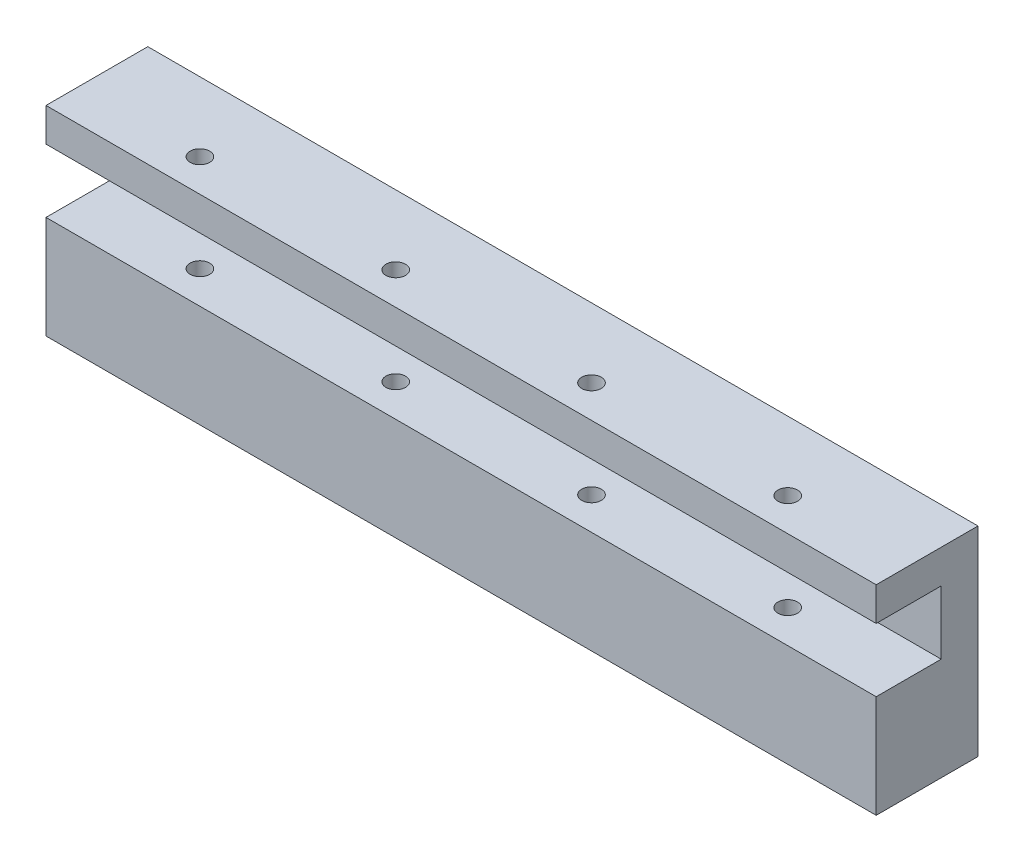
ISO-10303-21;
HEADER;
FILE_DESCRIPTION(('STEP AP214'),'2;1');
FILE_NAME('part.step','',(''),(''),'','','');
FILE_SCHEMA(('AUTOMOTIVE_DESIGN { 1 0 10303 214 1 1 1 1 }'));
ENDSEC;
DATA;
#1=APPLICATION_CONTEXT('core data for automotive mechanical design processes');
#2=APPLICATION_PROTOCOL_DEFINITION('international standard','automotive_design',2000,#1);
#3=PRODUCT_CONTEXT('',#1,'mechanical');
#4=PRODUCT('Part','Part','',(#3));
#5=PRODUCT_RELATED_PRODUCT_CATEGORY('part','',(#4));
#6=PRODUCT_DEFINITION_FORMATION('','',#4);
#7=PRODUCT_DEFINITION_CONTEXT('part definition',#1,'design');
#8=PRODUCT_DEFINITION('design','',#6,#7);
#9=PRODUCT_DEFINITION_SHAPE('','',#8);
#10=(LENGTH_UNIT() NAMED_UNIT(*) SI_UNIT(.MILLI.,.METRE.));
#11=(NAMED_UNIT(*) PLANE_ANGLE_UNIT() SI_UNIT($,.RADIAN.));
#12=(NAMED_UNIT(*) SI_UNIT($,.STERADIAN.) SOLID_ANGLE_UNIT());
#13=UNCERTAINTY_MEASURE_WITH_UNIT(LENGTH_MEASURE(1.E-05),#10,'distance_accuracy_value','');
#14=(GEOMETRIC_REPRESENTATION_CONTEXT(3) GLOBAL_UNCERTAINTY_ASSIGNED_CONTEXT((#13)) GLOBAL_UNIT_ASSIGNED_CONTEXT((#10,
#11,#12)) REPRESENTATION_CONTEXT('',''));
#15=CARTESIAN_POINT('',(0.,0.,0.));
#16=DIRECTION('',(0.,0.,1.));
#17=DIRECTION('',(1.,0.,0.));
#18=AXIS2_PLACEMENT_3D('',#15,#16,#17);
#19=CARTESIAN_POINT('',(-89.8910476017454,-16.65,-13.));
#20=DIRECTION('',(-1.,0.,0.));
#21=DIRECTION('',(0.,0.,1.));
#22=AXIS2_PLACEMENT_3D('',#19,#20,#21);
#23=PLANE('',#22);
#24=DIRECTION('',(0.,-1.,0.));
#25=VECTOR('',#24,1.);
#26=CARTESIAN_POINT('',(-89.8910476017454,-16.65,0.));
#27=LINE('',#26,#25);
#28=CARTESIAN_POINT('',(-89.8910476017454,-29.03,0.));
#29=VERTEX_POINT('',#28);
#30=CARTESIAN_POINT('',(-89.8910476017454,-42.15,0.));
#31=VERTEX_POINT('',#30);
#32=EDGE_CURVE('E131',#29,#31,#27,.T.);
#33=ORIENTED_EDGE('',*,*,#32,.F.);
#34=DIRECTION('',(0.,0.,-1.));
#35=VECTOR('',#34,1.);
#36=CARTESIAN_POINT('',(-89.8910476017454,-29.03,1.2E-05));
#37=LINE('',#36,#35);
#38=CARTESIAN_POINT('',(-89.8910476017454,-29.03,-8.3));
#39=VERTEX_POINT('',#38);
#40=EDGE_CURVE('E115',#29,#39,#37,.T.);
#41=ORIENTED_EDGE('',*,*,#40,.T.);
#42=DIRECTION('',(0.,-1.,0.));
#43=VECTOR('',#42,1.);
#44=CARTESIAN_POINT('',(-89.8910476017454,-20.93,-8.3));
#45=LINE('',#44,#43);
#46=CARTESIAN_POINT('',(-89.8910476017454,-20.93,-8.3));
#47=VERTEX_POINT('',#46);
#48=EDGE_CURVE('E121',#47,#39,#45,.T.);
#49=ORIENTED_EDGE('',*,*,#48,.F.);
#50=DIRECTION('',(0.,0.,-1.));
#51=VECTOR('',#50,1.);
#52=CARTESIAN_POINT('',(-89.8910476017454,-20.93,1.2E-05));
#53=LINE('',#52,#51);
#54=CARTESIAN_POINT('',(-89.8910476017454,-20.93,0.));
#55=VERTEX_POINT('',#54);
#56=EDGE_CURVE('E208',#55,#47,#53,.T.);
#57=ORIENTED_EDGE('',*,*,#56,.F.);
#58=CARTESIAN_POINT('',(-89.8910476017454,-16.65,0.));
#59=VERTEX_POINT('',#58);
#60=EDGE_CURVE('E133',#59,#55,#27,.T.);
#61=ORIENTED_EDGE('',*,*,#60,.F.);
#62=DIRECTION('',(0.,0.,1.));
#63=VECTOR('',#62,1.);
#64=CARTESIAN_POINT('',(-89.8910476017454,-16.65,-13.));
#65=LINE('',#64,#63);
#66=CARTESIAN_POINT('',(-89.8910476017454,-16.65,-13.));
#67=VERTEX_POINT('',#66);
#68=EDGE_CURVE('E60',#67,#59,#65,.T.);
#69=ORIENTED_EDGE('',*,*,#68,.F.);
#70=DIRECTION('',(0.,-1.,0.));
#71=VECTOR('',#70,1.);
#72=CARTESIAN_POINT('',(-89.8910476017454,-16.65,-13.));
#73=LINE('',#72,#71);
#74=CARTESIAN_POINT('',(-89.8910476017454,-42.15,-13.));
#75=VERTEX_POINT('',#74);
#76=EDGE_CURVE('E138',#67,#75,#73,.T.);
#77=ORIENTED_EDGE('',*,*,#76,.T.);
#78=DIRECTION('',(0.,0.,1.));
#79=VECTOR('',#78,1.);
#80=CARTESIAN_POINT('',(-89.8910476017454,-42.15,-13.));
#81=LINE('',#80,#79);
#82=EDGE_CURVE('E87',#75,#31,#81,.T.);
#83=ORIENTED_EDGE('',*,*,#82,.T.);
#84=EDGE_LOOP('',(#33,#41,#49,#57,#61,#69,#77,#83));
#85=FACE_BOUND('',#84,.T.);
#86=ADVANCED_FACE('F35',(#85),#23,.T.);
#87=CARTESIAN_POINT('',(16.1089523982546,-16.65,-13.));
#88=DIRECTION('',(1.,0.,0.));
#89=DIRECTION('',(0.,0.,-1.));
#90=AXIS2_PLACEMENT_3D('',#87,#88,#89);
#91=PLANE('',#90);
#92=DIRECTION('',(0.,1.,0.));
#93=VECTOR('',#92,1.);
#94=CARTESIAN_POINT('',(16.1089523982546,-20.93,-8.3));
#95=LINE('',#94,#93);
#96=CARTESIAN_POINT('',(16.1089523982546,-29.03,-8.3));
#97=VERTEX_POINT('',#96);
#98=CARTESIAN_POINT('',(16.1089523982546,-20.93,-8.3));
#99=VERTEX_POINT('',#98);
#100=EDGE_CURVE('E120',#97,#99,#95,.T.);
#101=ORIENTED_EDGE('',*,*,#100,.F.);
#102=DIRECTION('',(0.,0.,-1.));
#103=VECTOR('',#102,1.);
#104=CARTESIAN_POINT('',(16.1089523982546,-29.03,1.2E-05));
#105=LINE('',#104,#103);
#106=CARTESIAN_POINT('',(16.1089523982546,-29.03,0.));
#107=VERTEX_POINT('',#106);
#108=EDGE_CURVE('E117',#107,#97,#105,.T.);
#109=ORIENTED_EDGE('',*,*,#108,.F.);
#110=DIRECTION('',(0.,1.,0.));
#111=VECTOR('',#110,1.);
#112=CARTESIAN_POINT('',(16.1089523982546,-16.65,0.));
#113=LINE('',#112,#111);
#114=CARTESIAN_POINT('',(16.1089523982546,-42.15,0.));
#115=VERTEX_POINT('',#114);
#116=EDGE_CURVE('E153',#115,#107,#113,.T.);
#117=ORIENTED_EDGE('',*,*,#116,.F.);
#118=DIRECTION('',(0.,0.,1.));
#119=VECTOR('',#118,1.);
#120=CARTESIAN_POINT('',(16.1089523982546,-42.15,-13.));
#121=LINE('',#120,#119);
#122=CARTESIAN_POINT('',(16.1089523982546,-42.15,-13.));
#123=VERTEX_POINT('',#122);
#124=EDGE_CURVE('E162',#123,#115,#121,.T.);
#125=ORIENTED_EDGE('',*,*,#124,.F.);
#126=DIRECTION('',(0.,1.,0.));
#127=VECTOR('',#126,1.);
#128=CARTESIAN_POINT('',(16.1089523982546,-16.65,-13.));
#129=LINE('',#128,#127);
#130=CARTESIAN_POINT('',(16.1089523982546,-16.65,-13.));
#131=VERTEX_POINT('',#130);
#132=EDGE_CURVE('E143',#123,#131,#129,.T.);
#133=ORIENTED_EDGE('',*,*,#132,.T.);
#134=DIRECTION('',(0.,0.,1.));
#135=VECTOR('',#134,1.);
#136=CARTESIAN_POINT('',(16.1089523982546,-16.65,-13.));
#137=LINE('',#136,#135);
#138=CARTESIAN_POINT('',(16.1089523982546,-16.65,0.));
#139=VERTEX_POINT('',#138);
#140=EDGE_CURVE('E159',#131,#139,#137,.T.);
#141=ORIENTED_EDGE('',*,*,#140,.T.);
#142=CARTESIAN_POINT('',(16.1089523982546,-20.93,0.));
#143=VERTEX_POINT('',#142);
#144=EDGE_CURVE('E152',#143,#139,#113,.T.);
#145=ORIENTED_EDGE('',*,*,#144,.F.);
#146=DIRECTION('',(0.,0.,-1.));
#147=VECTOR('',#146,1.);
#148=CARTESIAN_POINT('',(16.1089523982546,-20.93,1.2E-05));
#149=LINE('',#148,#147);
#150=EDGE_CURVE('E51',#143,#99,#149,.T.);
#151=ORIENTED_EDGE('',*,*,#150,.T.);
#152=EDGE_LOOP('',(#101,#109,#117,#125,#133,#141,#145,#151));
#153=FACE_BOUND('',#152,.T.);
#154=ADVANCED_FACE('F211',(#153),#91,.T.);
#155=CARTESIAN_POINT('',(0.,0.,0.));
#156=DIRECTION('',(0.,0.,1.));
#157=DIRECTION('',(1.,0.,0.));
#158=AXIS2_PLACEMENT_3D('',#155,#156,#157);
#159=PLANE('',#158);
#160=ORIENTED_EDGE('',*,*,#116,.T.);
#161=DIRECTION('',(-1.,0.,0.));
#162=VECTOR('',#161,1.);
#163=CARTESIAN_POINT('',(0.,-29.03,0.));
#164=LINE('',#163,#162);
#165=EDGE_CURVE('E11',#107,#29,#164,.T.);
#166=ORIENTED_EDGE('',*,*,#165,.T.);
#167=ORIENTED_EDGE('',*,*,#32,.T.);
#168=DIRECTION('',(1.,0.,0.));
#169=VECTOR('',#168,1.);
#170=CARTESIAN_POINT('',(-89.8910476017454,-42.15,0.));
#171=LINE('',#170,#169);
#172=EDGE_CURVE('E149',#31,#115,#171,.T.);
#173=ORIENTED_EDGE('',*,*,#172,.T.);
#174=EDGE_LOOP('',(#160,#166,#167,#173));
#175=FACE_BOUND('',#174,.T.);
#176=ADVANCED_FACE('F233',(#175),#159,.T.);
#177=ORIENTED_EDGE('',*,*,#60,.T.);
#178=DIRECTION('',(1.,0.,0.));
#179=VECTOR('',#178,1.);
#180=CARTESIAN_POINT('',(0.,-20.93,0.));
#181=LINE('',#180,#179);
#182=EDGE_CURVE('E43',#55,#143,#181,.T.);
#183=ORIENTED_EDGE('',*,*,#182,.T.);
#184=ORIENTED_EDGE('',*,*,#144,.T.);
#185=DIRECTION('',(-1.,0.,0.));
#186=VECTOR('',#185,1.);
#187=CARTESIAN_POINT('',(-89.8910476017454,-16.65,0.));
#188=LINE('',#187,#186);
#189=EDGE_CURVE('E141',#139,#59,#188,.T.);
#190=ORIENTED_EDGE('',*,*,#189,.T.);
#191=EDGE_LOOP('',(#177,#183,#184,#190));
#192=FACE_BOUND('',#191,.T.);
#193=ADVANCED_FACE('F213',(#192),#159,.T.);
#194=CARTESIAN_POINT('',(-89.8910476017454,-16.65,-13.));
#195=DIRECTION('',(0.,1.,0.));
#196=DIRECTION('',(0.,0.,1.));
#197=AXIS2_PLACEMENT_3D('',#194,#195,#196);
#198=PLANE('',#197);
#199=CARTESIAN_POINT('',(-74.3909856023909,-16.65,-4.15));
#200=DIRECTION('',(0.,1.,0.));
#201=DIRECTION('',(0.,0.,1.));
#202=AXIS2_PLACEMENT_3D('',#199,#200,#201);
#203=CIRCLE('',#202,1.25);
#204=CARTESIAN_POINT('',(-74.3909856023909,-16.65,-2.9));
#205=VERTEX_POINT('',#204);
#206=EDGE_CURVE('E295',#205,#205,#203,.T.);
#207=ORIENTED_EDGE('',*,*,#206,.F.);
#208=EDGE_LOOP('',(#207));
#209=FACE_BOUND('',#208,.T.);
#210=CARTESIAN_POINT('',(-49.3909856023909,-16.65,-4.15));
#211=DIRECTION('',(0.,1.,0.));
#212=DIRECTION('',(0.,0.,1.));
#213=AXIS2_PLACEMENT_3D('',#210,#211,#212);
#214=CIRCLE('',#213,1.24999999999999);
#215=CARTESIAN_POINT('',(-49.3909856023909,-16.65,-2.90000000000001));
#216=VERTEX_POINT('',#215);
#217=EDGE_CURVE('E180',#216,#216,#214,.T.);
#218=ORIENTED_EDGE('',*,*,#217,.F.);
#219=EDGE_LOOP('',(#218));
#220=FACE_BOUND('',#219,.T.);
#221=CARTESIAN_POINT('',(0.608952398254592,-16.65,-4.20567731927423));
#222=DIRECTION('',(0.,1.,0.));
#223=DIRECTION('',(0.,0.,1.));
#224=AXIS2_PLACEMENT_3D('',#221,#222,#223);
#225=CIRCLE('',#224,1.25);
#226=CARTESIAN_POINT('',(0.608952398254592,-16.65,-2.95567731927423));
#227=VERTEX_POINT('',#226);
#228=EDGE_CURVE('E177',#227,#227,#225,.T.);
#229=ORIENTED_EDGE('',*,*,#228,.F.);
#230=EDGE_LOOP('',(#229));
#231=FACE_BOUND('',#230,.T.);
#232=CARTESIAN_POINT('',(-24.3909856023909,-16.65,-4.15));
#233=DIRECTION('',(0.,1.,0.));
#234=DIRECTION('',(0.,0.,1.));
#235=AXIS2_PLACEMENT_3D('',#232,#233,#234);
#236=CIRCLE('',#235,1.25);
#237=CARTESIAN_POINT('',(-24.3909856023909,-16.65,-2.9));
#238=VERTEX_POINT('',#237);
#239=EDGE_CURVE('E195',#238,#238,#236,.T.);
#240=ORIENTED_EDGE('',*,*,#239,.F.);
#241=EDGE_LOOP('',(#240));
#242=FACE_BOUND('',#241,.T.);
#243=ORIENTED_EDGE('',*,*,#189,.F.);
#244=ORIENTED_EDGE('',*,*,#140,.F.);
#245=DIRECTION('',(-1.,0.,0.));
#246=VECTOR('',#245,1.);
#247=CARTESIAN_POINT('',(-89.8910476017454,-16.65,-13.));
#248=LINE('',#247,#246);
#249=EDGE_CURVE('E146',#131,#67,#248,.T.);
#250=ORIENTED_EDGE('',*,*,#249,.T.);
#251=ORIENTED_EDGE('',*,*,#68,.T.);
#252=EDGE_LOOP('',(#243,#244,#250,#251));
#253=FACE_BOUND('',#252,.T.);
#254=ADVANCED_FACE('F241',(#209,#220,#231,#242,#253),#198,.T.);
#255=CARTESIAN_POINT('',(-89.8910476017454,-42.15,-13.));
#256=DIRECTION('',(0.,-1.,0.));
#257=DIRECTION('',(0.,0.,-1.));
#258=AXIS2_PLACEMENT_3D('',#255,#256,#257);
#259=PLANE('',#258);
#260=CARTESIAN_POINT('',(-74.3909856023909,-42.15,-4.15));
#261=DIRECTION('',(0.,1.,0.));
#262=DIRECTION('',(0.,0.,1.));
#263=AXIS2_PLACEMENT_3D('',#260,#261,#262);
#264=CIRCLE('',#263,1.24999999999999);
#265=CARTESIAN_POINT('',(-74.3909856023909,-42.15,-2.90000000000001));
#266=VERTEX_POINT('',#265);
#267=EDGE_CURVE('E254',#266,#266,#264,.T.);
#268=ORIENTED_EDGE('',*,*,#267,.T.);
#269=EDGE_LOOP('',(#268));
#270=FACE_BOUND('',#269,.T.);
#271=CARTESIAN_POINT('',(-49.3909856023909,-42.15,-4.15));
#272=DIRECTION('',(0.,1.,0.));
#273=DIRECTION('',(0.,0.,1.));
#274=AXIS2_PLACEMENT_3D('',#271,#272,#273);
#275=CIRCLE('',#274,1.24999999999999);
#276=CARTESIAN_POINT('',(-49.3909856023909,-42.15,-2.90000000000001));
#277=VERTEX_POINT('',#276);
#278=EDGE_CURVE('E173',#277,#277,#275,.T.);
#279=ORIENTED_EDGE('',*,*,#278,.T.);
#280=EDGE_LOOP('',(#279));
#281=FACE_BOUND('',#280,.T.);
#282=CARTESIAN_POINT('',(0.608952398254592,-42.15,-4.20567731927423));
#283=DIRECTION('',(0.,1.,0.));
#284=DIRECTION('',(0.,0.,1.));
#285=AXIS2_PLACEMENT_3D('',#282,#283,#284);
#286=CIRCLE('',#285,1.24999999999999);
#287=CARTESIAN_POINT('',(0.608952398254592,-42.15,-2.95567731927423));
#288=VERTEX_POINT('',#287);
#289=EDGE_CURVE('E169',#288,#288,#286,.T.);
#290=ORIENTED_EDGE('',*,*,#289,.T.);
#291=EDGE_LOOP('',(#290));
#292=FACE_BOUND('',#291,.T.);
#293=CARTESIAN_POINT('',(-24.3909856023909,-42.15,-4.15));
#294=DIRECTION('',(0.,1.,0.));
#295=DIRECTION('',(0.,0.,1.));
#296=AXIS2_PLACEMENT_3D('',#293,#294,#295);
#297=CIRCLE('',#296,1.24999999999999);
#298=CARTESIAN_POINT('',(-24.3909856023909,-42.15,-2.90000000000001));
#299=VERTEX_POINT('',#298);
#300=EDGE_CURVE('E198',#299,#299,#297,.T.);
#301=ORIENTED_EDGE('',*,*,#300,.T.);
#302=EDGE_LOOP('',(#301));
#303=FACE_BOUND('',#302,.T.);
#304=ORIENTED_EDGE('',*,*,#172,.F.);
#305=ORIENTED_EDGE('',*,*,#82,.F.);
#306=DIRECTION('',(1.,0.,0.));
#307=VECTOR('',#306,1.);
#308=CARTESIAN_POINT('',(-89.8910476017454,-42.15,-13.));
#309=LINE('',#308,#307);
#310=EDGE_CURVE('E140',#75,#123,#309,.T.);
#311=ORIENTED_EDGE('',*,*,#310,.T.);
#312=ORIENTED_EDGE('',*,*,#124,.T.);
#313=EDGE_LOOP('',(#304,#305,#311,#312));
#314=FACE_BOUND('',#313,.T.);
#315=ADVANCED_FACE('F242',(#270,#281,#292,#303,#314),#259,.T.);
#316=CARTESIAN_POINT('',(0.,0.,-13.));
#317=DIRECTION('',(0.,0.,1.));
#318=DIRECTION('',(1.,0.,0.));
#319=AXIS2_PLACEMENT_3D('',#316,#317,#318);
#320=PLANE('',#319);
#321=ORIENTED_EDGE('',*,*,#76,.F.);
#322=ORIENTED_EDGE('',*,*,#249,.F.);
#323=ORIENTED_EDGE('',*,*,#132,.F.);
#324=ORIENTED_EDGE('',*,*,#310,.F.);
#325=EDGE_LOOP('',(#321,#322,#323,#324));
#326=FACE_BOUND('',#325,.T.);
#327=ADVANCED_FACE('F224',(#326),#320,.F.);
#328=CARTESIAN_POINT('',(-89.8910476017454,-29.03,1.2E-05));
#329=DIRECTION('',(0.,1.,0.));
#330=DIRECTION('',(0.,0.,1.));
#331=AXIS2_PLACEMENT_3D('',#328,#329,#330);
#332=PLANE('',#331);
#333=CARTESIAN_POINT('',(-74.3909856023909,-29.03,-4.15));
#334=DIRECTION('',(0.,1.,0.));
#335=DIRECTION('',(0.,0.,1.));
#336=AXIS2_PLACEMENT_3D('',#333,#334,#335);
#337=CIRCLE('',#336,1.24999999999999);
#338=CARTESIAN_POINT('',(-74.3909856023909,-29.03,-2.90000000000001));
#339=VERTEX_POINT('',#338);
#340=EDGE_CURVE('E185',#339,#339,#337,.T.);
#341=ORIENTED_EDGE('',*,*,#340,.F.);
#342=EDGE_LOOP('',(#341));
#343=FACE_BOUND('',#342,.T.);
#344=CARTESIAN_POINT('',(-49.3909856023909,-29.03,-4.15));
#345=DIRECTION('',(0.,1.,0.));
#346=DIRECTION('',(0.,0.,1.));
#347=AXIS2_PLACEMENT_3D('',#344,#345,#346);
#348=CIRCLE('',#347,1.24999999999999);
#349=CARTESIAN_POINT('',(-49.3909856023909,-29.03,-2.90000000000001));
#350=VERTEX_POINT('',#349);
#351=EDGE_CURVE('E172',#350,#350,#348,.T.);
#352=ORIENTED_EDGE('',*,*,#351,.F.);
#353=EDGE_LOOP('',(#352));
#354=FACE_BOUND('',#353,.T.);
#355=CARTESIAN_POINT('',(0.608952398254592,-29.03,-4.20567731927423));
#356=DIRECTION('',(0.,1.,0.));
#357=DIRECTION('',(0.,0.,1.));
#358=AXIS2_PLACEMENT_3D('',#355,#356,#357);
#359=CIRCLE('',#358,1.25);
#360=CARTESIAN_POINT('',(0.608952398254592,-29.03,-2.95567731927423));
#361=VERTEX_POINT('',#360);
#362=EDGE_CURVE('E166',#361,#361,#359,.T.);
#363=ORIENTED_EDGE('',*,*,#362,.F.);
#364=EDGE_LOOP('',(#363));
#365=FACE_BOUND('',#364,.T.);
#366=CARTESIAN_POINT('',(-24.3909856023909,-29.03,-4.15));
#367=DIRECTION('',(0.,1.,0.));
#368=DIRECTION('',(0.,0.,1.));
#369=AXIS2_PLACEMENT_3D('',#366,#367,#368);
#370=CIRCLE('',#369,1.25);
#371=CARTESIAN_POINT('',(-24.3909856023909,-29.03,-2.9));
#372=VERTEX_POINT('',#371);
#373=EDGE_CURVE('E201',#372,#372,#370,.T.);
#374=ORIENTED_EDGE('',*,*,#373,.F.);
#375=EDGE_LOOP('',(#374));
#376=FACE_BOUND('',#375,.T.);
#377=ORIENTED_EDGE('',*,*,#108,.T.);
#378=DIRECTION('',(1.,0.,0.));
#379=VECTOR('',#378,1.);
#380=CARTESIAN_POINT('',(-89.8910476017454,-29.03,-8.3));
#381=LINE('',#380,#379);
#382=EDGE_CURVE('E111',#39,#97,#381,.T.);
#383=ORIENTED_EDGE('',*,*,#382,.F.);
#384=ORIENTED_EDGE('',*,*,#40,.F.);
#385=ORIENTED_EDGE('',*,*,#165,.F.);
#386=EDGE_LOOP('',(#377,#383,#384,#385));
#387=FACE_BOUND('',#386,.T.);
#388=ADVANCED_FACE('F113',(#343,#354,#365,#376,#387),#332,.T.);
#389=CARTESIAN_POINT('',(-89.8910476017454,-20.93,1.2E-05));
#390=DIRECTION('',(0.,-1.,0.));
#391=DIRECTION('',(0.,0.,-1.));
#392=AXIS2_PLACEMENT_3D('',#389,#390,#391);
#393=PLANE('',#392);
#394=CARTESIAN_POINT('',(-74.3909856023909,-20.93,-4.15));
#395=DIRECTION('',(0.,-1.,0.));
#396=DIRECTION('',(0.,0.,-1.));
#397=AXIS2_PLACEMENT_3D('',#394,#395,#396);
#398=CIRCLE('',#397,1.24999999999999);
#399=CARTESIAN_POINT('',(-74.3909856023909,-20.93,-5.39999999999999));
#400=VERTEX_POINT('',#399);
#401=EDGE_CURVE('E38',#400,#400,#398,.T.);
#402=ORIENTED_EDGE('',*,*,#401,.F.);
#403=EDGE_LOOP('',(#402));
#404=FACE_BOUND('',#403,.T.);
#405=CARTESIAN_POINT('',(-49.3909856023909,-20.93,-4.15));
#406=DIRECTION('',(0.,-1.,0.));
#407=DIRECTION('',(0.,0.,-1.));
#408=AXIS2_PLACEMENT_3D('',#405,#406,#407);
#409=CIRCLE('',#408,1.24999999999999);
#410=CARTESIAN_POINT('',(-49.3909856023909,-20.93,-5.39999999999999));
#411=VERTEX_POINT('',#410);
#412=EDGE_CURVE('E170',#411,#411,#409,.T.);
#413=ORIENTED_EDGE('',*,*,#412,.F.);
#414=EDGE_LOOP('',(#413));
#415=FACE_BOUND('',#414,.T.);
#416=CARTESIAN_POINT('',(0.608952398254592,-20.93,-4.20567731927423));
#417=DIRECTION('',(0.,-1.,0.));
#418=DIRECTION('',(0.,0.,-1.));
#419=AXIS2_PLACEMENT_3D('',#416,#417,#418);
#420=CIRCLE('',#419,1.25);
#421=CARTESIAN_POINT('',(0.608952398254592,-20.93,-5.45567731927422));
#422=VERTEX_POINT('',#421);
#423=EDGE_CURVE('E168',#422,#422,#420,.T.);
#424=ORIENTED_EDGE('',*,*,#423,.F.);
#425=EDGE_LOOP('',(#424));
#426=FACE_BOUND('',#425,.T.);
#427=CARTESIAN_POINT('',(-24.3909856023909,-20.93,-4.15));
#428=DIRECTION('',(0.,-1.,0.));
#429=DIRECTION('',(0.,0.,-1.));
#430=AXIS2_PLACEMENT_3D('',#427,#428,#429);
#431=CIRCLE('',#430,1.25);
#432=CARTESIAN_POINT('',(-24.3909856023909,-20.93,-5.4));
#433=VERTEX_POINT('',#432);
#434=EDGE_CURVE('E128',#433,#433,#431,.T.);
#435=ORIENTED_EDGE('',*,*,#434,.F.);
#436=EDGE_LOOP('',(#435));
#437=FACE_BOUND('',#436,.T.);
#438=ORIENTED_EDGE('',*,*,#56,.T.);
#439=DIRECTION('',(-1.,0.,0.));
#440=VECTOR('',#439,1.);
#441=CARTESIAN_POINT('',(-89.8910476017454,-20.93,-8.3));
#442=LINE('',#441,#440);
#443=EDGE_CURVE('E126',#99,#47,#442,.T.);
#444=ORIENTED_EDGE('',*,*,#443,.F.);
#445=ORIENTED_EDGE('',*,*,#150,.F.);
#446=ORIENTED_EDGE('',*,*,#182,.F.);
#447=EDGE_LOOP('',(#438,#444,#445,#446));
#448=FACE_BOUND('',#447,.T.);
#449=ADVANCED_FACE('F214',(#404,#415,#426,#437,#448),#393,.T.);
#450=CARTESIAN_POINT('',(0.,0.,-8.3));
#451=DIRECTION('',(0.,0.,1.));
#452=DIRECTION('',(1.,0.,0.));
#453=AXIS2_PLACEMENT_3D('',#450,#451,#452);
#454=PLANE('',#453);
#455=ORIENTED_EDGE('',*,*,#48,.T.);
#456=ORIENTED_EDGE('',*,*,#382,.T.);
#457=ORIENTED_EDGE('',*,*,#100,.T.);
#458=ORIENTED_EDGE('',*,*,#443,.T.);
#459=EDGE_LOOP('',(#455,#456,#457,#458));
#460=FACE_BOUND('',#459,.T.);
#461=ADVANCED_FACE('F125',(#460),#454,.T.);
#462=CARTESIAN_POINT('',(-24.3909856023909,-16.65,-4.15));
#463=DIRECTION('',(0.,1.,0.));
#464=DIRECTION('',(0.,0.,1.));
#465=AXIS2_PLACEMENT_3D('',#462,#463,#464);
#466=CYLINDRICAL_SURFACE('',#465,1.25);
#467=ORIENTED_EDGE('',*,*,#373,.T.);
#468=EDGE_LOOP('',(#467));
#469=FACE_BOUND('',#468,.T.);
#470=ORIENTED_EDGE('',*,*,#300,.F.);
#471=EDGE_LOOP('',(#470));
#472=FACE_BOUND('',#471,.T.);
#473=ADVANCED_FACE('F222',(#469,#472),#466,.F.);
#474=ORIENTED_EDGE('',*,*,#434,.T.);
#475=EDGE_LOOP('',(#474));
#476=FACE_BOUND('',#475,.T.);
#477=ORIENTED_EDGE('',*,*,#239,.T.);
#478=EDGE_LOOP('',(#477));
#479=FACE_BOUND('',#478,.T.);
#480=ADVANCED_FACE('F264',(#476,#479),#466,.F.);
#481=CARTESIAN_POINT('',(0.608952398254592,-16.65,-4.20567731927423));
#482=DIRECTION('',(0.,1.,0.));
#483=DIRECTION('',(0.,0.,1.));
#484=AXIS2_PLACEMENT_3D('',#481,#482,#483);
#485=CYLINDRICAL_SURFACE('',#484,1.25);
#486=ORIENTED_EDGE('',*,*,#362,.T.);
#487=EDGE_LOOP('',(#486));
#488=FACE_BOUND('',#487,.T.);
#489=ORIENTED_EDGE('',*,*,#289,.F.);
#490=EDGE_LOOP('',(#489));
#491=FACE_BOUND('',#490,.T.);
#492=ADVANCED_FACE('F270',(#488,#491),#485,.F.);
#493=ORIENTED_EDGE('',*,*,#423,.T.);
#494=EDGE_LOOP('',(#493));
#495=FACE_BOUND('',#494,.T.);
#496=ORIENTED_EDGE('',*,*,#228,.T.);
#497=EDGE_LOOP('',(#496));
#498=FACE_BOUND('',#497,.T.);
#499=ADVANCED_FACE('F275',(#495,#498),#485,.F.);
#500=CARTESIAN_POINT('',(-49.3909856023909,-16.65,-4.15));
#501=DIRECTION('',(0.,1.,0.));
#502=DIRECTION('',(0.,0.,1.));
#503=AXIS2_PLACEMENT_3D('',#500,#501,#502);
#504=CYLINDRICAL_SURFACE('',#503,1.24999999999999);
#505=ORIENTED_EDGE('',*,*,#412,.T.);
#506=EDGE_LOOP('',(#505));
#507=FACE_BOUND('',#506,.T.);
#508=ORIENTED_EDGE('',*,*,#217,.T.);
#509=EDGE_LOOP('',(#508));
#510=FACE_BOUND('',#509,.T.);
#511=ADVANCED_FACE('F277',(#507,#510),#504,.F.);
#512=ORIENTED_EDGE('',*,*,#351,.T.);
#513=EDGE_LOOP('',(#512));
#514=FACE_BOUND('',#513,.T.);
#515=ORIENTED_EDGE('',*,*,#278,.F.);
#516=EDGE_LOOP('',(#515));
#517=FACE_BOUND('',#516,.T.);
#518=ADVANCED_FACE('F280',(#514,#517),#504,.F.);
#519=CARTESIAN_POINT('',(-74.3909856023909,-16.65,-4.15));
#520=DIRECTION('',(0.,1.,0.));
#521=DIRECTION('',(0.,0.,1.));
#522=AXIS2_PLACEMENT_3D('',#519,#520,#521);
#523=CYLINDRICAL_SURFACE('',#522,1.24999999999999);
#524=ORIENTED_EDGE('',*,*,#401,.T.);
#525=EDGE_LOOP('',(#524));
#526=FACE_BOUND('',#525,.T.);
#527=ORIENTED_EDGE('',*,*,#206,.T.);
#528=EDGE_LOOP('',(#527));
#529=FACE_BOUND('',#528,.T.);
#530=ADVANCED_FACE('F281',(#526,#529),#523,.F.);
#531=ORIENTED_EDGE('',*,*,#340,.T.);
#532=EDGE_LOOP('',(#531));
#533=FACE_BOUND('',#532,.T.);
#534=ORIENTED_EDGE('',*,*,#267,.F.);
#535=EDGE_LOOP('',(#534));
#536=FACE_BOUND('',#535,.T.);
#537=ADVANCED_FACE('F283',(#533,#536),#523,.F.);
#538=CLOSED_SHELL('',(#86,#154,#176,#193,#254,#315,#327,#388,#449,#461,#473,#480,#492,#499,#511,
#518,#530,#537));
#539=MANIFOLD_SOLID_BREP('B2',#538);
#540=ADVANCED_BREP_SHAPE_REPRESENTATION('',(#18,#539),#14);
#541=SHAPE_DEFINITION_REPRESENTATION(#9,#540);
ENDSEC;
END-ISO-10303-21;
